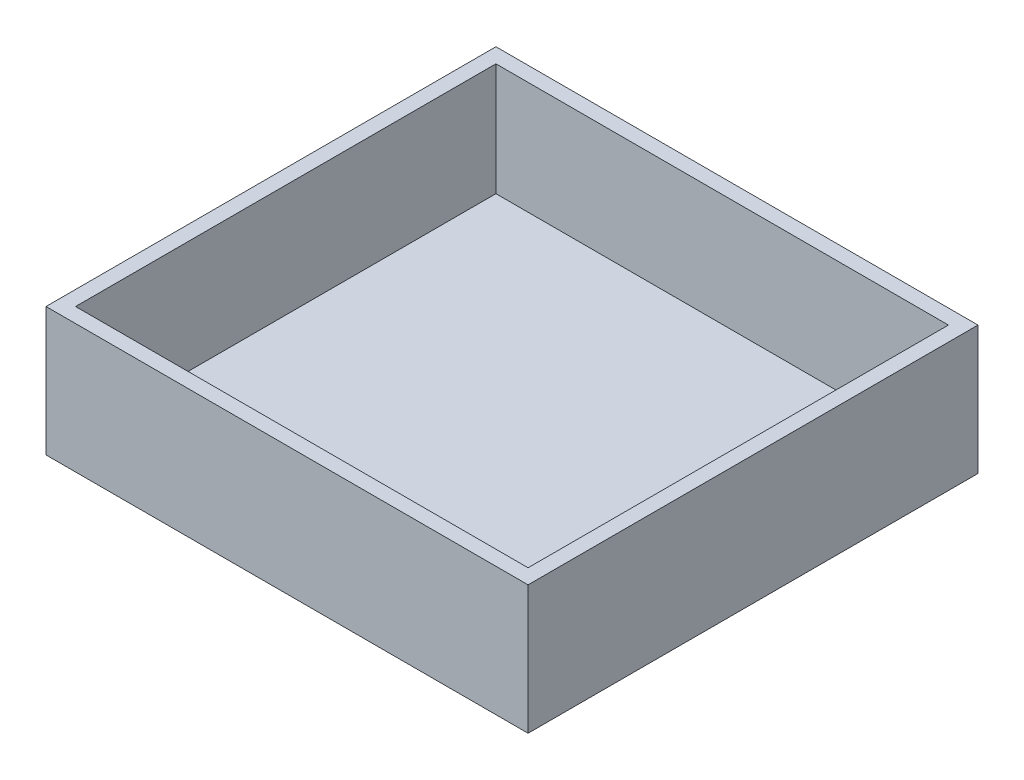
ISO-10303-21;
HEADER;
FILE_DESCRIPTION(('STEP AP214'),'2;1');
FILE_NAME('part.step','',(''),(''),'','','');
FILE_SCHEMA(('AUTOMOTIVE_DESIGN { 1 0 10303 214 1 1 1 1 }'));
ENDSEC;
DATA;
#1=APPLICATION_CONTEXT('core data for automotive mechanical design processes');
#2=APPLICATION_PROTOCOL_DEFINITION('international standard','automotive_design',2000,#1);
#3=PRODUCT_CONTEXT('',#1,'mechanical');
#4=PRODUCT('Part','Part','',(#3));
#5=PRODUCT_RELATED_PRODUCT_CATEGORY('part','',(#4));
#6=PRODUCT_DEFINITION_FORMATION('','',#4);
#7=PRODUCT_DEFINITION_CONTEXT('part definition',#1,'design');
#8=PRODUCT_DEFINITION('design','',#6,#7);
#9=PRODUCT_DEFINITION_SHAPE('','',#8);
#10=(LENGTH_UNIT() NAMED_UNIT(*) SI_UNIT(.MILLI.,.METRE.));
#11=(NAMED_UNIT(*) PLANE_ANGLE_UNIT() SI_UNIT($,.RADIAN.));
#12=(NAMED_UNIT(*) SI_UNIT($,.STERADIAN.) SOLID_ANGLE_UNIT());
#13=UNCERTAINTY_MEASURE_WITH_UNIT(LENGTH_MEASURE(1.E-05),#10,'distance_accuracy_value','');
#14=(GEOMETRIC_REPRESENTATION_CONTEXT(3) GLOBAL_UNCERTAINTY_ASSIGNED_CONTEXT((#13)) GLOBAL_UNIT_ASSIGNED_CONTEXT((#10,
#11,#12)) REPRESENTATION_CONTEXT('',''));
#15=CARTESIAN_POINT('',(0.,0.,0.));
#16=DIRECTION('',(0.,0.,1.));
#17=DIRECTION('',(1.,0.,0.));
#18=AXIS2_PLACEMENT_3D('',#15,#16,#17);
#19=CARTESIAN_POINT('',(-95.25,50.8,88.9));
#20=DIRECTION('',(-1.,0.,0.));
#21=DIRECTION('',(0.,0.,1.));
#22=AXIS2_PLACEMENT_3D('',#19,#20,#21);
#23=PLANE('',#22);
#24=DIRECTION('',(0.,0.,-1.));
#25=VECTOR('',#24,1.);
#26=CARTESIAN_POINT('',(-95.25,0.,88.9));
#27=LINE('',#26,#25);
#28=CARTESIAN_POINT('',(-95.25,0.,88.9));
#29=VERTEX_POINT('',#28);
#30=CARTESIAN_POINT('',(-95.25,0.,-88.9));
#31=VERTEX_POINT('',#30);
#32=EDGE_CURVE('E144',#29,#31,#27,.T.);
#33=ORIENTED_EDGE('',*,*,#32,.F.);
#34=DIRECTION('',(0.,-1.,0.));
#35=VECTOR('',#34,1.);
#36=CARTESIAN_POINT('',(-95.25,50.8,88.9));
#37=LINE('',#36,#35);
#38=CARTESIAN_POINT('',(-95.25,50.8,88.9));
#39=VERTEX_POINT('',#38);
#40=EDGE_CURVE('E11',#39,#29,#37,.T.);
#41=ORIENTED_EDGE('',*,*,#40,.F.);
#42=DIRECTION('',(0.,0.,-1.));
#43=VECTOR('',#42,1.);
#44=CARTESIAN_POINT('',(-95.25,50.8,88.9));
#45=LINE('',#44,#43);
#46=CARTESIAN_POINT('',(-95.25,50.8,-88.9));
#47=VERTEX_POINT('',#46);
#48=EDGE_CURVE('E148',#39,#47,#45,.T.);
#49=ORIENTED_EDGE('',*,*,#48,.T.);
#50=DIRECTION('',(0.,-1.,0.));
#51=VECTOR('',#50,1.);
#52=CARTESIAN_POINT('',(-95.25,50.8,-88.9));
#53=LINE('',#52,#51);
#54=EDGE_CURVE('E41',#47,#31,#53,.T.);
#55=ORIENTED_EDGE('',*,*,#54,.T.);
#56=EDGE_LOOP('',(#33,#41,#49,#55));
#57=FACE_BOUND('',#56,.T.);
#58=ADVANCED_FACE('F38',(#57),#23,.T.);
#59=CARTESIAN_POINT('',(-95.25,50.8,88.9));
#60=DIRECTION('',(0.,0.,-1.));
#61=DIRECTION('',(-1.,0.,0.));
#62=AXIS2_PLACEMENT_3D('',#59,#60,#61);
#63=PLANE('',#62);
#64=DIRECTION('',(1.,0.,0.));
#65=VECTOR('',#64,1.);
#66=CARTESIAN_POINT('',(-95.25,0.,88.9));
#67=LINE('',#66,#65);
#68=CARTESIAN_POINT('',(95.25,0.,88.9));
#69=VERTEX_POINT('',#68);
#70=EDGE_CURVE('E151',#29,#69,#67,.T.);
#71=ORIENTED_EDGE('',*,*,#70,.T.);
#72=DIRECTION('',(0.,-1.,0.));
#73=VECTOR('',#72,1.);
#74=CARTESIAN_POINT('',(95.25,50.8,88.9));
#75=LINE('',#74,#73);
#76=CARTESIAN_POINT('',(95.25,50.8,88.9));
#77=VERTEX_POINT('',#76);
#78=EDGE_CURVE('E46',#77,#69,#75,.T.);
#79=ORIENTED_EDGE('',*,*,#78,.F.);
#80=DIRECTION('',(1.,0.,0.));
#81=VECTOR('',#80,1.);
#82=CARTESIAN_POINT('',(-95.25,50.8,88.9));
#83=LINE('',#82,#81);
#84=EDGE_CURVE('E155',#39,#77,#83,.T.);
#85=ORIENTED_EDGE('',*,*,#84,.F.);
#86=ORIENTED_EDGE('',*,*,#40,.T.);
#87=EDGE_LOOP('',(#71,#79,#85,#86));
#88=FACE_BOUND('',#87,.T.);
#89=ADVANCED_FACE('F175',(#88),#63,.F.);
#90=CARTESIAN_POINT('',(95.25,50.8,88.9));
#91=DIRECTION('',(-1.,0.,0.));
#92=DIRECTION('',(0.,0.,1.));
#93=AXIS2_PLACEMENT_3D('',#90,#91,#92);
#94=PLANE('',#93);
#95=DIRECTION('',(0.,0.,-1.));
#96=VECTOR('',#95,1.);
#97=CARTESIAN_POINT('',(95.25,0.,88.9));
#98=LINE('',#97,#96);
#99=CARTESIAN_POINT('',(95.25,0.,-88.9));
#100=VERTEX_POINT('',#99);
#101=EDGE_CURVE('E162',#69,#100,#98,.T.);
#102=ORIENTED_EDGE('',*,*,#101,.T.);
#103=DIRECTION('',(0.,-1.,0.));
#104=VECTOR('',#103,1.);
#105=CARTESIAN_POINT('',(95.25,50.8,-88.9));
#106=LINE('',#105,#104);
#107=CARTESIAN_POINT('',(95.25,50.8,-88.9));
#108=VERTEX_POINT('',#107);
#109=EDGE_CURVE('E167',#108,#100,#106,.T.);
#110=ORIENTED_EDGE('',*,*,#109,.F.);
#111=DIRECTION('',(0.,0.,-1.));
#112=VECTOR('',#111,1.);
#113=CARTESIAN_POINT('',(95.25,50.8,88.9));
#114=LINE('',#113,#112);
#115=EDGE_CURVE('E153',#77,#108,#114,.T.);
#116=ORIENTED_EDGE('',*,*,#115,.F.);
#117=ORIENTED_EDGE('',*,*,#78,.T.);
#118=EDGE_LOOP('',(#102,#110,#116,#117));
#119=FACE_BOUND('',#118,.T.);
#120=ADVANCED_FACE('F178',(#119),#94,.F.);
#121=CARTESIAN_POINT('',(-95.25,50.8,-88.9));
#122=DIRECTION('',(0.,0.,-1.));
#123=DIRECTION('',(-1.,0.,0.));
#124=AXIS2_PLACEMENT_3D('',#121,#122,#123);
#125=PLANE('',#124);
#126=DIRECTION('',(1.,0.,0.));
#127=VECTOR('',#126,1.);
#128=CARTESIAN_POINT('',(-95.25,0.,-88.9));
#129=LINE('',#128,#127);
#130=EDGE_CURVE('E159',#31,#100,#129,.T.);
#131=ORIENTED_EDGE('',*,*,#130,.F.);
#132=ORIENTED_EDGE('',*,*,#54,.F.);
#133=DIRECTION('',(1.,0.,0.));
#134=VECTOR('',#133,1.);
#135=CARTESIAN_POINT('',(-95.25,50.8,-88.9));
#136=LINE('',#135,#134);
#137=EDGE_CURVE('E150',#47,#108,#136,.T.);
#138=ORIENTED_EDGE('',*,*,#137,.T.);
#139=ORIENTED_EDGE('',*,*,#109,.T.);
#140=EDGE_LOOP('',(#131,#132,#138,#139));
#141=FACE_BOUND('',#140,.T.);
#142=ADVANCED_FACE('F170',(#141),#125,.T.);
#143=CARTESIAN_POINT('',(0.,50.8,0.));
#144=DIRECTION('',(0.,-1.,0.));
#145=DIRECTION('',(0.,0.,-1.));
#146=AXIS2_PLACEMENT_3D('',#143,#144,#145);
#147=PLANE('',#146);
#148=DIRECTION('',(-1.,0.,0.));
#149=VECTOR('',#148,1.);
#150=CARTESIAN_POINT('',(-89.408,50.8,-83.058));
#151=LINE('',#150,#149);
#152=CARTESIAN_POINT('',(89.408,50.8,-83.058));
#153=VERTEX_POINT('',#152);
#154=CARTESIAN_POINT('',(-89.408,50.8,-83.058));
#155=VERTEX_POINT('',#154);
#156=EDGE_CURVE('E138',#153,#155,#151,.T.);
#157=ORIENTED_EDGE('',*,*,#156,.F.);
#158=DIRECTION('',(0.,0.,-1.));
#159=VECTOR('',#158,1.);
#160=CARTESIAN_POINT('',(89.408,50.8,83.058));
#161=LINE('',#160,#159);
#162=CARTESIAN_POINT('',(89.408,50.8,83.058));
#163=VERTEX_POINT('',#162);
#164=EDGE_CURVE('E54',#163,#153,#161,.T.);
#165=ORIENTED_EDGE('',*,*,#164,.F.);
#166=DIRECTION('',(1.,0.,0.));
#167=VECTOR('',#166,1.);
#168=CARTESIAN_POINT('',(-89.408,50.8,83.058));
#169=LINE('',#168,#167);
#170=CARTESIAN_POINT('',(-89.408,50.8,83.058));
#171=VERTEX_POINT('',#170);
#172=EDGE_CURVE('E129',#171,#163,#169,.T.);
#173=ORIENTED_EDGE('',*,*,#172,.F.);
#174=DIRECTION('',(0.,0.,1.));
#175=VECTOR('',#174,1.);
#176=CARTESIAN_POINT('',(-89.408,50.8,83.058));
#177=LINE('',#176,#175);
#178=EDGE_CURVE('E132',#155,#171,#177,.T.);
#179=ORIENTED_EDGE('',*,*,#178,.F.);
#180=EDGE_LOOP('',(#157,#165,#173,#179));
#181=FACE_BOUND('',#180,.T.);
#182=ORIENTED_EDGE('',*,*,#48,.F.);
#183=ORIENTED_EDGE('',*,*,#84,.T.);
#184=ORIENTED_EDGE('',*,*,#115,.T.);
#185=ORIENTED_EDGE('',*,*,#137,.F.);
#186=EDGE_LOOP('',(#182,#183,#184,#185));
#187=FACE_BOUND('',#186,.T.);
#188=ADVANCED_FACE('F180',(#181,#187),#147,.F.);
#189=CARTESIAN_POINT('',(0.,0.,0.));
#190=DIRECTION('',(0.,-1.,0.));
#191=DIRECTION('',(0.,0.,-1.));
#192=AXIS2_PLACEMENT_3D('',#189,#190,#191);
#193=PLANE('',#192);
#194=ORIENTED_EDGE('',*,*,#32,.T.);
#195=ORIENTED_EDGE('',*,*,#130,.T.);
#196=ORIENTED_EDGE('',*,*,#101,.F.);
#197=ORIENTED_EDGE('',*,*,#70,.F.);
#198=EDGE_LOOP('',(#194,#195,#196,#197));
#199=FACE_BOUND('',#198,.T.);
#200=ADVANCED_FACE('F173',(#199),#193,.T.);
#201=CARTESIAN_POINT('',(89.408,6.35,83.058));
#202=DIRECTION('',(1.,0.,0.));
#203=DIRECTION('',(0.,0.,-1.));
#204=AXIS2_PLACEMENT_3D('',#201,#202,#203);
#205=PLANE('',#204);
#206=ORIENTED_EDGE('',*,*,#164,.T.);
#207=DIRECTION('',(0.,1.,0.));
#208=VECTOR('',#207,1.);
#209=CARTESIAN_POINT('',(89.408,6.35,-83.058));
#210=LINE('',#209,#208);
#211=CARTESIAN_POINT('',(89.408,6.35,-83.058));
#212=VERTEX_POINT('',#211);
#213=EDGE_CURVE('E107',#212,#153,#210,.T.);
#214=ORIENTED_EDGE('',*,*,#213,.F.);
#215=DIRECTION('',(0.,0.,-1.));
#216=VECTOR('',#215,1.);
#217=CARTESIAN_POINT('',(89.408,6.35,83.058));
#218=LINE('',#217,#216);
#219=CARTESIAN_POINT('',(89.408,6.35,83.058));
#220=VERTEX_POINT('',#219);
#221=EDGE_CURVE('E111',#220,#212,#218,.T.);
#222=ORIENTED_EDGE('',*,*,#221,.F.);
#223=DIRECTION('',(0.,1.,0.));
#224=VECTOR('',#223,1.);
#225=CARTESIAN_POINT('',(89.408,6.35,83.058));
#226=LINE('',#225,#224);
#227=EDGE_CURVE('E142',#220,#163,#226,.T.);
#228=ORIENTED_EDGE('',*,*,#227,.T.);
#229=EDGE_LOOP('',(#206,#214,#222,#228));
#230=FACE_BOUND('',#229,.T.);
#231=ADVANCED_FACE('F109',(#230),#205,.F.);
#232=CARTESIAN_POINT('',(-89.408,6.35,83.058));
#233=DIRECTION('',(0.,0.,1.));
#234=DIRECTION('',(1.,0.,0.));
#235=AXIS2_PLACEMENT_3D('',#232,#233,#234);
#236=PLANE('',#235);
#237=ORIENTED_EDGE('',*,*,#172,.T.);
#238=ORIENTED_EDGE('',*,*,#227,.F.);
#239=DIRECTION('',(1.,0.,0.));
#240=VECTOR('',#239,1.);
#241=CARTESIAN_POINT('',(-89.408,6.35,83.058));
#242=LINE('',#241,#240);
#243=CARTESIAN_POINT('',(-89.408,6.35,83.058));
#244=VERTEX_POINT('',#243);
#245=EDGE_CURVE('E117',#244,#220,#242,.T.);
#246=ORIENTED_EDGE('',*,*,#245,.F.);
#247=DIRECTION('',(0.,1.,0.));
#248=VECTOR('',#247,1.);
#249=CARTESIAN_POINT('',(-89.408,6.35,83.058));
#250=LINE('',#249,#248);
#251=EDGE_CURVE('E145',#244,#171,#250,.T.);
#252=ORIENTED_EDGE('',*,*,#251,.T.);
#253=EDGE_LOOP('',(#237,#238,#246,#252));
#254=FACE_BOUND('',#253,.T.);
#255=ADVANCED_FACE('F227',(#254),#236,.F.);
#256=CARTESIAN_POINT('',(-89.408,6.35,83.058));
#257=DIRECTION('',(-1.,0.,0.));
#258=DIRECTION('',(0.,0.,1.));
#259=AXIS2_PLACEMENT_3D('',#256,#257,#258);
#260=PLANE('',#259);
#261=ORIENTED_EDGE('',*,*,#178,.T.);
#262=ORIENTED_EDGE('',*,*,#251,.F.);
#263=DIRECTION('',(0.,0.,1.));
#264=VECTOR('',#263,1.);
#265=CARTESIAN_POINT('',(-89.408,6.35,83.058));
#266=LINE('',#265,#264);
#267=CARTESIAN_POINT('',(-89.408,6.35,-83.058));
#268=VERTEX_POINT('',#267);
#269=EDGE_CURVE('E125',#268,#244,#266,.T.);
#270=ORIENTED_EDGE('',*,*,#269,.F.);
#271=DIRECTION('',(0.,1.,0.));
#272=VECTOR('',#271,1.);
#273=CARTESIAN_POINT('',(-89.408,6.35,-83.058));
#274=LINE('',#273,#272);
#275=EDGE_CURVE('E116',#268,#155,#274,.T.);
#276=ORIENTED_EDGE('',*,*,#275,.T.);
#277=EDGE_LOOP('',(#261,#262,#270,#276));
#278=FACE_BOUND('',#277,.T.);
#279=ADVANCED_FACE('F236',(#278),#260,.F.);
#280=CARTESIAN_POINT('',(-89.408,6.35,-83.058));
#281=DIRECTION('',(0.,0.,-1.));
#282=DIRECTION('',(-1.,0.,0.));
#283=AXIS2_PLACEMENT_3D('',#280,#281,#282);
#284=PLANE('',#283);
#285=ORIENTED_EDGE('',*,*,#156,.T.);
#286=ORIENTED_EDGE('',*,*,#275,.F.);
#287=DIRECTION('',(-1.,0.,0.));
#288=VECTOR('',#287,1.);
#289=CARTESIAN_POINT('',(-89.408,6.35,-83.058));
#290=LINE('',#289,#288);
#291=EDGE_CURVE('E120',#212,#268,#290,.T.);
#292=ORIENTED_EDGE('',*,*,#291,.F.);
#293=ORIENTED_EDGE('',*,*,#213,.T.);
#294=EDGE_LOOP('',(#285,#286,#292,#293));
#295=FACE_BOUND('',#294,.T.);
#296=ADVANCED_FACE('F121',(#295),#284,.F.);
#297=CARTESIAN_POINT('',(0.,6.35,0.));
#298=DIRECTION('',(0.,-1.,0.));
#299=DIRECTION('',(0.,0.,-1.));
#300=AXIS2_PLACEMENT_3D('',#297,#298,#299);
#301=PLANE('',#300);
#302=ORIENTED_EDGE('',*,*,#221,.T.);
#303=ORIENTED_EDGE('',*,*,#291,.T.);
#304=ORIENTED_EDGE('',*,*,#269,.T.);
#305=ORIENTED_EDGE('',*,*,#245,.T.);
#306=EDGE_LOOP('',(#302,#303,#304,#305));
#307=FACE_BOUND('',#306,.T.);
#308=ADVANCED_FACE('F127',(#307),#301,.F.);
#309=CLOSED_SHELL('',(#58,#89,#120,#142,#188,#200,#231,#255,#279,#296,#308));
#310=MANIFOLD_SOLID_BREP('B2',#309);
#311=ADVANCED_BREP_SHAPE_REPRESENTATION('',(#18,#310),#14);
#312=SHAPE_DEFINITION_REPRESENTATION(#9,#311);
ENDSEC;
END-ISO-10303-21;
